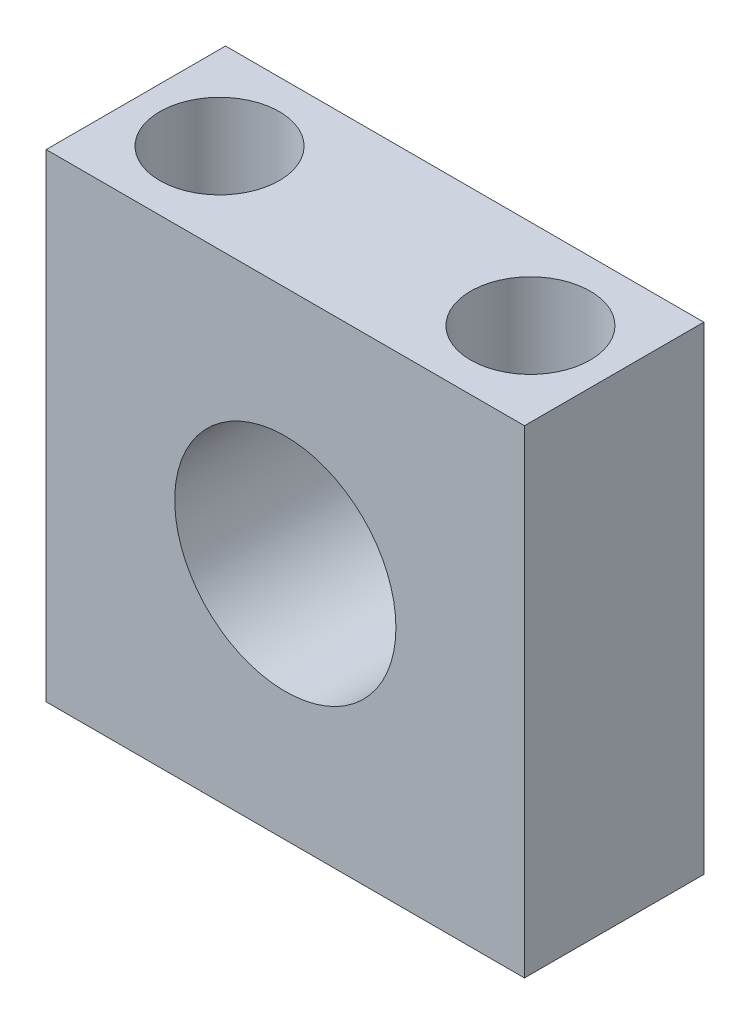
ISO-10303-21;
HEADER;
FILE_DESCRIPTION(('STEP AP214'),'2;1');
FILE_NAME('part.step','',(''),(''),'','','');
FILE_SCHEMA(('AUTOMOTIVE_DESIGN { 1 0 10303 214 1 1 1 1 }'));
ENDSEC;
DATA;
#1=APPLICATION_CONTEXT('core data for automotive mechanical design processes');
#2=APPLICATION_PROTOCOL_DEFINITION('international standard','automotive_design',2000,#1);
#3=PRODUCT_CONTEXT('',#1,'mechanical');
#4=PRODUCT('Part','Part','',(#3));
#5=PRODUCT_RELATED_PRODUCT_CATEGORY('part','',(#4));
#6=PRODUCT_DEFINITION_FORMATION('','',#4);
#7=PRODUCT_DEFINITION_CONTEXT('part definition',#1,'design');
#8=PRODUCT_DEFINITION('design','',#6,#7);
#9=PRODUCT_DEFINITION_SHAPE('','',#8);
#10=(LENGTH_UNIT() NAMED_UNIT(*) SI_UNIT(.MILLI.,.METRE.));
#11=(NAMED_UNIT(*) PLANE_ANGLE_UNIT() SI_UNIT($,.RADIAN.));
#12=(NAMED_UNIT(*) SI_UNIT($,.STERADIAN.) SOLID_ANGLE_UNIT());
#13=UNCERTAINTY_MEASURE_WITH_UNIT(LENGTH_MEASURE(1.E-05),#10,'distance_accuracy_value','');
#14=(GEOMETRIC_REPRESENTATION_CONTEXT(3) GLOBAL_UNCERTAINTY_ASSIGNED_CONTEXT((#13)) GLOBAL_UNIT_ASSIGNED_CONTEXT((#10,
#11,#12)) REPRESENTATION_CONTEXT('',''));
#15=CARTESIAN_POINT('',(0.,0.,0.));
#16=DIRECTION('',(0.,0.,1.));
#17=DIRECTION('',(1.,0.,0.));
#18=AXIS2_PLACEMENT_3D('',#15,#16,#17);
#19=CARTESIAN_POINT('',(-20.,-20.,15.));
#20=DIRECTION('',(1.,0.,0.));
#21=DIRECTION('',(0.,0.,-1.));
#22=AXIS2_PLACEMENT_3D('',#19,#20,#21);
#23=PLANE('',#22);
#24=DIRECTION('',(0.,-1.,0.));
#25=VECTOR('',#24,1.);
#26=CARTESIAN_POINT('',(-20.,-20.,0.));
#27=LINE('',#26,#25);
#28=CARTESIAN_POINT('',(-20.,20.,0.));
#29=VERTEX_POINT('',#28);
#30=CARTESIAN_POINT('',(-20.,-20.,0.));
#31=VERTEX_POINT('',#30);
#32=EDGE_CURVE('E97',#29,#31,#27,.T.);
#33=ORIENTED_EDGE('',*,*,#32,.T.);
#34=DIRECTION('',(0.,0.,-1.));
#35=VECTOR('',#34,1.);
#36=CARTESIAN_POINT('',(-20.,-20.,15.));
#37=LINE('',#36,#35);
#38=CARTESIAN_POINT('',(-20.,-20.,15.));
#39=VERTEX_POINT('',#38);
#40=EDGE_CURVE('E11',#39,#31,#37,.T.);
#41=ORIENTED_EDGE('',*,*,#40,.F.);
#42=DIRECTION('',(0.,-1.,0.));
#43=VECTOR('',#42,1.);
#44=CARTESIAN_POINT('',(-20.,-20.,15.));
#45=LINE('',#44,#43);
#46=CARTESIAN_POINT('',(-20.,20.,15.));
#47=VERTEX_POINT('',#46);
#48=EDGE_CURVE('E85',#47,#39,#45,.T.);
#49=ORIENTED_EDGE('',*,*,#48,.F.);
#50=DIRECTION('',(0.,0.,-1.));
#51=VECTOR('',#50,1.);
#52=CARTESIAN_POINT('',(-20.,20.,15.));
#53=LINE('',#52,#51);
#54=EDGE_CURVE('E93',#47,#29,#53,.T.);
#55=ORIENTED_EDGE('',*,*,#54,.T.);
#56=EDGE_LOOP('',(#33,#41,#49,#55));
#57=FACE_BOUND('',#56,.T.);
#58=ADVANCED_FACE('F34',(#57),#23,.F.);
#59=CARTESIAN_POINT('',(20.,-20.,15.));
#60=DIRECTION('',(0.,1.,0.));
#61=DIRECTION('',(-1.,0.,0.));
#62=AXIS2_PLACEMENT_3D('',#59,#60,#61);
#63=PLANE('',#62);
#64=CARTESIAN_POINT('',(-13.,-20.,7.5));
#65=DIRECTION('',(0.,1.,0.));
#66=DIRECTION('',(0.,0.,1.));
#67=AXIS2_PLACEMENT_3D('',#64,#65,#66);
#68=CIRCLE('',#67,3.29999999999999);
#69=CARTESIAN_POINT('',(-13.,-20.,10.8));
#70=VERTEX_POINT('',#69);
#71=EDGE_CURVE('E128',#70,#70,#68,.T.);
#72=ORIENTED_EDGE('',*,*,#71,.T.);
#73=EDGE_LOOP('',(#72));
#74=FACE_BOUND('',#73,.T.);
#75=CARTESIAN_POINT('',(13.,-20.,7.5));
#76=DIRECTION('',(0.,1.,0.));
#77=DIRECTION('',(0.,0.,1.));
#78=AXIS2_PLACEMENT_3D('',#75,#76,#77);
#79=CIRCLE('',#78,3.29999999999999);
#80=CARTESIAN_POINT('',(13.,-20.,10.8));
#81=VERTEX_POINT('',#80);
#82=EDGE_CURVE('E116',#81,#81,#79,.T.);
#83=ORIENTED_EDGE('',*,*,#82,.T.);
#84=EDGE_LOOP('',(#83));
#85=FACE_BOUND('',#84,.T.);
#86=DIRECTION('',(1.,0.,0.));
#87=VECTOR('',#86,1.);
#88=CARTESIAN_POINT('',(20.,-20.,0.));
#89=LINE('',#88,#87);
#90=CARTESIAN_POINT('',(20.,-20.,0.));
#91=VERTEX_POINT('',#90);
#92=EDGE_CURVE('E89',#31,#91,#89,.T.);
#93=ORIENTED_EDGE('',*,*,#92,.T.);
#94=DIRECTION('',(0.,0.,-1.));
#95=VECTOR('',#94,1.);
#96=CARTESIAN_POINT('',(20.,-20.,15.));
#97=LINE('',#96,#95);
#98=CARTESIAN_POINT('',(20.,-20.,15.));
#99=VERTEX_POINT('',#98);
#100=EDGE_CURVE('E42',#99,#91,#97,.T.);
#101=ORIENTED_EDGE('',*,*,#100,.F.);
#102=DIRECTION('',(1.,0.,0.));
#103=VECTOR('',#102,1.);
#104=CARTESIAN_POINT('',(20.,-20.,15.));
#105=LINE('',#104,#103);
#106=EDGE_CURVE('E80',#39,#99,#105,.T.);
#107=ORIENTED_EDGE('',*,*,#106,.F.);
#108=ORIENTED_EDGE('',*,*,#40,.T.);
#109=EDGE_LOOP('',(#93,#101,#107,#108));
#110=FACE_BOUND('',#109,.T.);
#111=ADVANCED_FACE('F88',(#74,#85,#110),#63,.F.);
#112=CARTESIAN_POINT('',(20.,-20.,15.));
#113=DIRECTION('',(-1.,0.,0.));
#114=DIRECTION('',(0.,0.,1.));
#115=AXIS2_PLACEMENT_3D('',#112,#113,#114);
#116=PLANE('',#115);
#117=DIRECTION('',(0.,1.,0.));
#118=VECTOR('',#117,1.);
#119=CARTESIAN_POINT('',(20.,-20.,0.));
#120=LINE('',#119,#118);
#121=CARTESIAN_POINT('',(20.,20.,0.));
#122=VERTEX_POINT('',#121);
#123=EDGE_CURVE('E67',#91,#122,#120,.T.);
#124=ORIENTED_EDGE('',*,*,#123,.T.);
#125=DIRECTION('',(0.,0.,-1.));
#126=VECTOR('',#125,1.);
#127=CARTESIAN_POINT('',(20.,20.,15.));
#128=LINE('',#127,#126);
#129=CARTESIAN_POINT('',(20.,20.,15.));
#130=VERTEX_POINT('',#129);
#131=EDGE_CURVE('E90',#130,#122,#128,.T.);
#132=ORIENTED_EDGE('',*,*,#131,.F.);
#133=DIRECTION('',(0.,1.,0.));
#134=VECTOR('',#133,1.);
#135=CARTESIAN_POINT('',(20.,-20.,15.));
#136=LINE('',#135,#134);
#137=EDGE_CURVE('E83',#99,#130,#136,.T.);
#138=ORIENTED_EDGE('',*,*,#137,.F.);
#139=ORIENTED_EDGE('',*,*,#100,.T.);
#140=EDGE_LOOP('',(#124,#132,#138,#139));
#141=FACE_BOUND('',#140,.T.);
#142=ADVANCED_FACE('F91',(#141),#116,.F.);
#143=CARTESIAN_POINT('',(20.,20.,15.));
#144=DIRECTION('',(0.,-1.,0.));
#145=DIRECTION('',(1.,0.,0.));
#146=AXIS2_PLACEMENT_3D('',#143,#144,#145);
#147=PLANE('',#146);
#148=CARTESIAN_POINT('',(-13.,20.,7.5));
#149=DIRECTION('',(0.,1.,0.));
#150=DIRECTION('',(0.,0.,1.));
#151=AXIS2_PLACEMENT_3D('',#148,#149,#150);
#152=CIRCLE('',#151,5.);
#153=CARTESIAN_POINT('',(-13.,20.,12.5));
#154=VERTEX_POINT('',#153);
#155=EDGE_CURVE('E137',#154,#154,#152,.T.);
#156=ORIENTED_EDGE('',*,*,#155,.F.);
#157=EDGE_LOOP('',(#156));
#158=FACE_BOUND('',#157,.T.);
#159=CARTESIAN_POINT('',(13.,20.,7.5));
#160=DIRECTION('',(0.,1.,0.));
#161=DIRECTION('',(0.,0.,1.));
#162=AXIS2_PLACEMENT_3D('',#159,#160,#161);
#163=CIRCLE('',#162,5.);
#164=CARTESIAN_POINT('',(13.,20.,12.5));
#165=VERTEX_POINT('',#164);
#166=EDGE_CURVE('E125',#165,#165,#163,.T.);
#167=ORIENTED_EDGE('',*,*,#166,.F.);
#168=EDGE_LOOP('',(#167));
#169=FACE_BOUND('',#168,.T.);
#170=DIRECTION('',(-1.,0.,0.));
#171=VECTOR('',#170,1.);
#172=CARTESIAN_POINT('',(20.,20.,0.));
#173=LINE('',#172,#171);
#174=EDGE_CURVE('E73',#122,#29,#173,.T.);
#175=ORIENTED_EDGE('',*,*,#174,.T.);
#176=ORIENTED_EDGE('',*,*,#54,.F.);
#177=DIRECTION('',(-1.,0.,0.));
#178=VECTOR('',#177,1.);
#179=CARTESIAN_POINT('',(20.,20.,15.));
#180=LINE('',#179,#178);
#181=EDGE_CURVE('E50',#130,#47,#180,.T.);
#182=ORIENTED_EDGE('',*,*,#181,.F.);
#183=ORIENTED_EDGE('',*,*,#131,.T.);
#184=EDGE_LOOP('',(#175,#176,#182,#183));
#185=FACE_BOUND('',#184,.T.);
#186=ADVANCED_FACE('F105',(#158,#169,#185),#147,.F.);
#187=CARTESIAN_POINT('',(-20.,20.,15.));
#188=DIRECTION('',(0.,0.,1.));
#189=DIRECTION('',(1.,0.,0.));
#190=AXIS2_PLACEMENT_3D('',#187,#188,#189);
#191=PLANE('',#190);
#192=CARTESIAN_POINT('',(0.,0.,15.));
#193=DIRECTION('',(0.,0.,1.));
#194=DIRECTION('',(1.,0.,0.));
#195=AXIS2_PLACEMENT_3D('',#192,#193,#194);
#196=CIRCLE('',#195,9.24999999999999);
#197=CARTESIAN_POINT('',(9.24999999999999,0.,15.));
#198=VERTEX_POINT('',#197);
#199=EDGE_CURVE('E113',#198,#198,#196,.T.);
#200=ORIENTED_EDGE('',*,*,#199,.F.);
#201=EDGE_LOOP('',(#200));
#202=FACE_BOUND('',#201,.T.);
#203=ORIENTED_EDGE('',*,*,#48,.T.);
#204=ORIENTED_EDGE('',*,*,#106,.T.);
#205=ORIENTED_EDGE('',*,*,#137,.T.);
#206=ORIENTED_EDGE('',*,*,#181,.T.);
#207=EDGE_LOOP('',(#203,#204,#205,#206));
#208=FACE_BOUND('',#207,.T.);
#209=ADVANCED_FACE('F81',(#202,#208),#191,.T.);
#210=CARTESIAN_POINT('',(-20.,20.,0.));
#211=DIRECTION('',(0.,0.,1.));
#212=DIRECTION('',(1.,0.,0.));
#213=AXIS2_PLACEMENT_3D('',#210,#211,#212);
#214=PLANE('',#213);
#215=CARTESIAN_POINT('',(0.,0.,0.));
#216=DIRECTION('',(0.,0.,1.));
#217=DIRECTION('',(1.,0.,0.));
#218=AXIS2_PLACEMENT_3D('',#215,#216,#217);
#219=CIRCLE('',#218,9.24999999999999);
#220=CARTESIAN_POINT('',(9.24999999999999,0.,0.));
#221=VERTEX_POINT('',#220);
#222=EDGE_CURVE('E100',#221,#221,#219,.T.);
#223=ORIENTED_EDGE('',*,*,#222,.T.);
#224=EDGE_LOOP('',(#223));
#225=FACE_BOUND('',#224,.T.);
#226=ORIENTED_EDGE('',*,*,#32,.F.);
#227=ORIENTED_EDGE('',*,*,#174,.F.);
#228=ORIENTED_EDGE('',*,*,#123,.F.);
#229=ORIENTED_EDGE('',*,*,#92,.F.);
#230=EDGE_LOOP('',(#226,#227,#228,#229));
#231=FACE_BOUND('',#230,.T.);
#232=ADVANCED_FACE('F108',(#225,#231),#214,.F.);
#233=CARTESIAN_POINT('',(0.,0.,15.));
#234=DIRECTION('',(0.,0.,1.));
#235=DIRECTION('',(1.,0.,0.));
#236=AXIS2_PLACEMENT_3D('',#233,#234,#235);
#237=CYLINDRICAL_SURFACE('',#236,9.24999999999999);
#238=ORIENTED_EDGE('',*,*,#199,.T.);
#239=EDGE_LOOP('',(#238));
#240=FACE_BOUND('',#239,.T.);
#241=ORIENTED_EDGE('',*,*,#222,.F.);
#242=EDGE_LOOP('',(#241));
#243=FACE_BOUND('',#242,.T.);
#244=ADVANCED_FACE('F178',(#240,#243),#237,.F.);
#245=CARTESIAN_POINT('',(13.,20.,7.5));
#246=DIRECTION('',(0.,1.,0.));
#247=DIRECTION('',(0.,0.,1.));
#248=AXIS2_PLACEMENT_3D('',#245,#246,#247);
#249=CYLINDRICAL_SURFACE('',#248,3.3);
#250=ORIENTED_EDGE('',*,*,#82,.F.);
#251=EDGE_LOOP('',(#250));
#252=FACE_BOUND('',#251,.T.);
#253=CARTESIAN_POINT('',(13.,9.99999999999999,7.5));
#254=DIRECTION('',(0.,1.,0.));
#255=DIRECTION('',(0.,0.,1.));
#256=AXIS2_PLACEMENT_3D('',#253,#254,#255);
#257=CIRCLE('',#256,3.3);
#258=CARTESIAN_POINT('',(13.,9.99999999999999,10.8));
#259=VERTEX_POINT('',#258);
#260=EDGE_CURVE('E119',#259,#259,#257,.T.);
#261=ORIENTED_EDGE('',*,*,#260,.T.);
#262=EDGE_LOOP('',(#261));
#263=FACE_BOUND('',#262,.T.);
#264=ADVANCED_FACE('F161',(#252,#263),#249,.F.);
#265=CARTESIAN_POINT('',(16.3,9.99999999999999,7.5));
#266=DIRECTION('',(0.,-1.,0.));
#267=DIRECTION('',(0.,0.,-1.));
#268=AXIS2_PLACEMENT_3D('',#265,#266,#267);
#269=PLANE('',#268);
#270=ORIENTED_EDGE('',*,*,#260,.F.);
#271=EDGE_LOOP('',(#270));
#272=FACE_BOUND('',#271,.T.);
#273=CARTESIAN_POINT('',(13.,9.99999999999999,7.5));
#274=DIRECTION('',(0.,1.,0.));
#275=DIRECTION('',(0.,0.,1.));
#276=AXIS2_PLACEMENT_3D('',#273,#274,#275);
#277=CIRCLE('',#276,5.);
#278=CARTESIAN_POINT('',(13.,9.99999999999999,12.5));
#279=VERTEX_POINT('',#278);
#280=EDGE_CURVE('E122',#279,#279,#277,.T.);
#281=ORIENTED_EDGE('',*,*,#280,.T.);
#282=EDGE_LOOP('',(#281));
#283=FACE_BOUND('',#282,.T.);
#284=ADVANCED_FACE('F151',(#272,#283),#269,.F.);
#285=CARTESIAN_POINT('',(13.,20.,7.5));
#286=DIRECTION('',(0.,1.,0.));
#287=DIRECTION('',(0.,0.,1.));
#288=AXIS2_PLACEMENT_3D('',#285,#286,#287);
#289=CYLINDRICAL_SURFACE('',#288,5.);
#290=ORIENTED_EDGE('',*,*,#280,.F.);
#291=EDGE_LOOP('',(#290));
#292=FACE_BOUND('',#291,.T.);
#293=ORIENTED_EDGE('',*,*,#166,.T.);
#294=EDGE_LOOP('',(#293));
#295=FACE_BOUND('',#294,.T.);
#296=ADVANCED_FACE('F148',(#292,#295),#289,.F.);
#297=CARTESIAN_POINT('',(-13.,20.,7.5));
#298=DIRECTION('',(0.,1.,0.));
#299=DIRECTION('',(0.,0.,1.));
#300=AXIS2_PLACEMENT_3D('',#297,#298,#299);
#301=CYLINDRICAL_SURFACE('',#300,3.29999999999999);
#302=ORIENTED_EDGE('',*,*,#71,.F.);
#303=EDGE_LOOP('',(#302));
#304=FACE_BOUND('',#303,.T.);
#305=CARTESIAN_POINT('',(-13.,9.99999999999999,7.5));
#306=DIRECTION('',(0.,1.,0.));
#307=DIRECTION('',(0.,0.,1.));
#308=AXIS2_PLACEMENT_3D('',#305,#306,#307);
#309=CIRCLE('',#308,3.3);
#310=CARTESIAN_POINT('',(-13.,9.99999999999999,10.8));
#311=VERTEX_POINT('',#310);
#312=EDGE_CURVE('E131',#311,#311,#309,.T.);
#313=ORIENTED_EDGE('',*,*,#312,.T.);
#314=EDGE_LOOP('',(#313));
#315=FACE_BOUND('',#314,.T.);
#316=ADVANCED_FACE('F150',(#304,#315),#301,.F.);
#317=CARTESIAN_POINT('',(-9.7,9.99999999999999,7.5));
#318=DIRECTION('',(0.,-1.,0.));
#319=DIRECTION('',(0.,0.,-1.));
#320=AXIS2_PLACEMENT_3D('',#317,#318,#319);
#321=PLANE('',#320);
#322=ORIENTED_EDGE('',*,*,#312,.F.);
#323=EDGE_LOOP('',(#322));
#324=FACE_BOUND('',#323,.T.);
#325=CARTESIAN_POINT('',(-13.,9.99999999999999,7.5));
#326=DIRECTION('',(0.,1.,0.));
#327=DIRECTION('',(0.,0.,1.));
#328=AXIS2_PLACEMENT_3D('',#325,#326,#327);
#329=CIRCLE('',#328,5.);
#330=CARTESIAN_POINT('',(-13.,9.99999999999999,12.5));
#331=VERTEX_POINT('',#330);
#332=EDGE_CURVE('E134',#331,#331,#329,.T.);
#333=ORIENTED_EDGE('',*,*,#332,.T.);
#334=EDGE_LOOP('',(#333));
#335=FACE_BOUND('',#334,.T.);
#336=ADVANCED_FACE('F158',(#324,#335),#321,.F.);
#337=CARTESIAN_POINT('',(-13.,20.,7.5));
#338=DIRECTION('',(0.,1.,0.));
#339=DIRECTION('',(0.,0.,1.));
#340=AXIS2_PLACEMENT_3D('',#337,#338,#339);
#341=CYLINDRICAL_SURFACE('',#340,5.);
#342=ORIENTED_EDGE('',*,*,#332,.F.);
#343=EDGE_LOOP('',(#342));
#344=FACE_BOUND('',#343,.T.);
#345=ORIENTED_EDGE('',*,*,#155,.T.);
#346=EDGE_LOOP('',(#345));
#347=FACE_BOUND('',#346,.T.);
#348=ADVANCED_FACE('F141',(#344,#347),#341,.F.);
#349=CLOSED_SHELL('',(#58,#111,#142,#186,#209,#232,#244,#264,#284,#296,#316,#336,#348));
#350=MANIFOLD_SOLID_BREP('B2',#349);
#351=ADVANCED_BREP_SHAPE_REPRESENTATION('',(#18,#350),#14);
#352=SHAPE_DEFINITION_REPRESENTATION(#9,#351);
ENDSEC;
END-ISO-10303-21;
